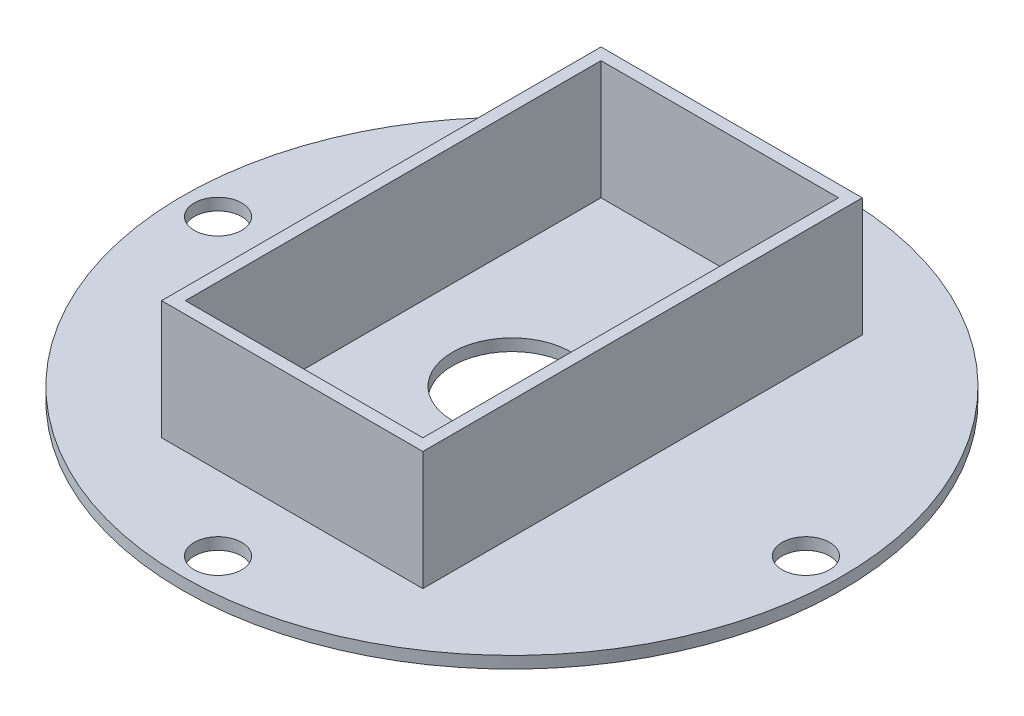
ISO-10303-21;
HEADER;
FILE_DESCRIPTION(('STEP AP214'),'2;1');
FILE_NAME('part.step','',(''),(''),'','','');
FILE_SCHEMA(('AUTOMOTIVE_DESIGN { 1 0 10303 214 1 1 1 1 }'));
ENDSEC;
DATA;
#1=APPLICATION_CONTEXT('core data for automotive mechanical design processes');
#2=APPLICATION_PROTOCOL_DEFINITION('international standard','automotive_design',2000,#1);
#3=PRODUCT_CONTEXT('',#1,'mechanical');
#4=PRODUCT('Part','Part','',(#3));
#5=PRODUCT_RELATED_PRODUCT_CATEGORY('part','',(#4));
#6=PRODUCT_DEFINITION_FORMATION('','',#4);
#7=PRODUCT_DEFINITION_CONTEXT('part definition',#1,'design');
#8=PRODUCT_DEFINITION('design','',#6,#7);
#9=PRODUCT_DEFINITION_SHAPE('','',#8);
#10=(LENGTH_UNIT() NAMED_UNIT(*) SI_UNIT(.MILLI.,.METRE.));
#11=(NAMED_UNIT(*) PLANE_ANGLE_UNIT() SI_UNIT($,.RADIAN.));
#12=(NAMED_UNIT(*) SI_UNIT($,.STERADIAN.) SOLID_ANGLE_UNIT());
#13=UNCERTAINTY_MEASURE_WITH_UNIT(LENGTH_MEASURE(1.E-05),#10,'distance_accuracy_value','');
#14=(GEOMETRIC_REPRESENTATION_CONTEXT(3) GLOBAL_UNCERTAINTY_ASSIGNED_CONTEXT((#13)) GLOBAL_UNIT_ASSIGNED_CONTEXT((#10,
#11,#12)) REPRESENTATION_CONTEXT('',''));
#15=CARTESIAN_POINT('',(0.,0.,0.));
#16=DIRECTION('',(0.,0.,1.));
#17=DIRECTION('',(1.,0.,0.));
#18=AXIS2_PLACEMENT_3D('',#15,#16,#17);
#19=CARTESIAN_POINT('',(0.,2.,0.));
#20=DIRECTION('',(0.,1.,0.));
#21=DIRECTION('',(0.,0.,1.));
#22=AXIS2_PLACEMENT_3D('',#19,#20,#21);
#23=PLANE('',#22);
#24=CARTESIAN_POINT('',(0.,2.,49.5));
#25=DIRECTION('',(0.,1.,0.));
#26=DIRECTION('',(0.,0.,1.));
#27=AXIS2_PLACEMENT_3D('',#24,#25,#26);
#28=CIRCLE('',#27,4.);
#29=CARTESIAN_POINT('',(0.,2.,53.5));
#30=VERTEX_POINT('',#29);
#31=EDGE_CURVE('E206',#30,#30,#28,.T.);
#32=ORIENTED_EDGE('',*,*,#31,.F.);
#33=EDGE_LOOP('',(#32));
#34=FACE_BOUND('',#33,.T.);
#35=CARTESIAN_POINT('',(49.5,2.,0.));
#36=DIRECTION('',(0.,1.,0.));
#37=DIRECTION('',(0.,0.,1.));
#38=AXIS2_PLACEMENT_3D('',#35,#36,#37);
#39=CIRCLE('',#38,4.);
#40=CARTESIAN_POINT('',(49.5,2.,4.));
#41=VERTEX_POINT('',#40);
#42=EDGE_CURVE('E222',#41,#41,#39,.T.);
#43=ORIENTED_EDGE('',*,*,#42,.F.);
#44=EDGE_LOOP('',(#43));
#45=FACE_BOUND('',#44,.T.);
#46=CARTESIAN_POINT('',(0.,2.,0.));
#47=DIRECTION('',(0.,1.,0.));
#48=DIRECTION('',(0.,0.,1.));
#49=AXIS2_PLACEMENT_3D('',#46,#47,#48);
#50=CIRCLE('',#49,55.5);
#51=CARTESIAN_POINT('',(0.,2.,55.5));
#52=VERTEX_POINT('',#51);
#53=EDGE_CURVE('E11',#52,#52,#50,.T.);
#54=ORIENTED_EDGE('',*,*,#53,.T.);
#55=EDGE_LOOP('',(#54));
#56=FACE_BOUND('',#55,.T.);
#57=CARTESIAN_POINT('',(0.,2.,-49.5));
#58=DIRECTION('',(0.,1.,0.));
#59=DIRECTION('',(0.,0.,1.));
#60=AXIS2_PLACEMENT_3D('',#57,#58,#59);
#61=CIRCLE('',#60,4.);
#62=CARTESIAN_POINT('',(0.,2.,-45.5));
#63=VERTEX_POINT('',#62);
#64=EDGE_CURVE('E230',#63,#63,#61,.T.);
#65=ORIENTED_EDGE('',*,*,#64,.F.);
#66=EDGE_LOOP('',(#65));
#67=FACE_BOUND('',#66,.T.);
#68=CARTESIAN_POINT('',(-49.5,2.,0.));
#69=DIRECTION('',(0.,1.,0.));
#70=DIRECTION('',(0.,0.,1.));
#71=AXIS2_PLACEMENT_3D('',#68,#69,#70);
#72=CIRCLE('',#71,4.);
#73=CARTESIAN_POINT('',(-49.5,2.,4.));
#74=VERTEX_POINT('',#73);
#75=EDGE_CURVE('E214',#74,#74,#72,.T.);
#76=ORIENTED_EDGE('',*,*,#75,.F.);
#77=EDGE_LOOP('',(#76));
#78=FACE_BOUND('',#77,.T.);
#79=DIRECTION('',(-1.,0.,0.));
#80=VECTOR('',#79,1.);
#81=CARTESIAN_POINT('',(-22.,2.,-37.));
#82=LINE('',#81,#80);
#83=CARTESIAN_POINT('',(22.,2.,-37.));
#84=VERTEX_POINT('',#83);
#85=CARTESIAN_POINT('',(-22.,2.,-37.));
#86=VERTEX_POINT('',#85);
#87=EDGE_CURVE('E185',#84,#86,#82,.T.);
#88=ORIENTED_EDGE('',*,*,#87,.F.);
#89=DIRECTION('',(0.,0.,-1.));
#90=VECTOR('',#89,1.);
#91=CARTESIAN_POINT('',(22.,2.,-37.));
#92=LINE('',#91,#90);
#93=CARTESIAN_POINT('',(22.,2.,37.));
#94=VERTEX_POINT('',#93);
#95=EDGE_CURVE('E134',#94,#84,#92,.T.);
#96=ORIENTED_EDGE('',*,*,#95,.F.);
#97=DIRECTION('',(1.,0.,0.));
#98=VECTOR('',#97,1.);
#99=CARTESIAN_POINT('',(-22.,2.,37.));
#100=LINE('',#99,#98);
#101=CARTESIAN_POINT('',(-22.,2.,37.));
#102=VERTEX_POINT('',#101);
#103=EDGE_CURVE('E172',#102,#94,#100,.T.);
#104=ORIENTED_EDGE('',*,*,#103,.F.);
#105=DIRECTION('',(0.,0.,1.));
#106=VECTOR('',#105,1.);
#107=CARTESIAN_POINT('',(-22.,2.,-37.));
#108=LINE('',#107,#106);
#109=EDGE_CURVE('E188',#86,#102,#108,.T.);
#110=ORIENTED_EDGE('',*,*,#109,.F.);
#111=EDGE_LOOP('',(#88,#96,#104,#110));
#112=FACE_BOUND('',#111,.T.);
#113=ADVANCED_FACE('F45',(#34,#45,#56,#67,#78,#112),#23,.T.);
#114=CARTESIAN_POINT('',(0.,0.,0.));
#115=DIRECTION('',(0.,1.,0.));
#116=DIRECTION('',(0.,0.,1.));
#117=AXIS2_PLACEMENT_3D('',#114,#115,#116);
#118=PLANE('',#117);
#119=CARTESIAN_POINT('',(0.,0.,0.));
#120=DIRECTION('',(0.,1.,0.));
#121=DIRECTION('',(0.,0.,1.));
#122=AXIS2_PLACEMENT_3D('',#119,#120,#121);
#123=CIRCLE('',#122,10.);
#124=CARTESIAN_POINT('',(0.,0.,10.));
#125=VERTEX_POINT('',#124);
#126=EDGE_CURVE('E49',#125,#125,#123,.T.);
#127=ORIENTED_EDGE('',*,*,#126,.T.);
#128=EDGE_LOOP('',(#127));
#129=FACE_BOUND('',#128,.T.);
#130=CARTESIAN_POINT('',(0.,0.,0.));
#131=DIRECTION('',(0.,1.,0.));
#132=DIRECTION('',(0.,0.,1.));
#133=AXIS2_PLACEMENT_3D('',#130,#131,#132);
#134=CIRCLE('',#133,55.5);
#135=CARTESIAN_POINT('',(0.,0.,55.5));
#136=VERTEX_POINT('',#135);
#137=EDGE_CURVE('E55',#136,#136,#134,.T.);
#138=ORIENTED_EDGE('',*,*,#137,.F.);
#139=EDGE_LOOP('',(#138));
#140=FACE_BOUND('',#139,.T.);
#141=CARTESIAN_POINT('',(0.,0.,-49.5));
#142=DIRECTION('',(0.,1.,0.));
#143=DIRECTION('',(0.,0.,1.));
#144=AXIS2_PLACEMENT_3D('',#141,#142,#143);
#145=CIRCLE('',#144,4.);
#146=CARTESIAN_POINT('',(0.,0.,-45.5));
#147=VERTEX_POINT('',#146);
#148=EDGE_CURVE('E226',#147,#147,#145,.T.);
#149=ORIENTED_EDGE('',*,*,#148,.T.);
#150=EDGE_LOOP('',(#149));
#151=FACE_BOUND('',#150,.T.);
#152=CARTESIAN_POINT('',(49.5,0.,0.));
#153=DIRECTION('',(0.,1.,0.));
#154=DIRECTION('',(0.,0.,1.));
#155=AXIS2_PLACEMENT_3D('',#152,#153,#154);
#156=CIRCLE('',#155,4.);
#157=CARTESIAN_POINT('',(49.5,0.,4.));
#158=VERTEX_POINT('',#157);
#159=EDGE_CURVE('E218',#158,#158,#156,.T.);
#160=ORIENTED_EDGE('',*,*,#159,.T.);
#161=EDGE_LOOP('',(#160));
#162=FACE_BOUND('',#161,.T.);
#163=CARTESIAN_POINT('',(-49.5,0.,0.));
#164=DIRECTION('',(0.,1.,0.));
#165=DIRECTION('',(0.,0.,1.));
#166=AXIS2_PLACEMENT_3D('',#163,#164,#165);
#167=CIRCLE('',#166,4.);
#168=CARTESIAN_POINT('',(-49.5,0.,4.));
#169=VERTEX_POINT('',#168);
#170=EDGE_CURVE('E210',#169,#169,#167,.T.);
#171=ORIENTED_EDGE('',*,*,#170,.T.);
#172=EDGE_LOOP('',(#171));
#173=FACE_BOUND('',#172,.T.);
#174=CARTESIAN_POINT('',(0.,0.,49.5));
#175=DIRECTION('',(0.,1.,0.));
#176=DIRECTION('',(0.,0.,1.));
#177=AXIS2_PLACEMENT_3D('',#174,#175,#176);
#178=CIRCLE('',#177,4.);
#179=CARTESIAN_POINT('',(0.,0.,53.5));
#180=VERTEX_POINT('',#179);
#181=EDGE_CURVE('E205',#180,#180,#178,.T.);
#182=ORIENTED_EDGE('',*,*,#181,.T.);
#183=EDGE_LOOP('',(#182));
#184=FACE_BOUND('',#183,.T.);
#185=ADVANCED_FACE('F241',(#129,#140,#151,#162,#173,#184),#118,.F.);
#186=CARTESIAN_POINT('',(0.,2.,0.));
#187=DIRECTION('',(0.,-1.,0.));
#188=DIRECTION('',(0.,0.,-1.));
#189=AXIS2_PLACEMENT_3D('',#186,#187,#188);
#190=CYLINDRICAL_SURFACE('',#189,55.5);
#191=ORIENTED_EDGE('',*,*,#53,.F.);
#192=EDGE_LOOP('',(#191));
#193=FACE_BOUND('',#192,.T.);
#194=ORIENTED_EDGE('',*,*,#137,.T.);
#195=EDGE_LOOP('',(#194));
#196=FACE_BOUND('',#195,.T.);
#197=ADVANCED_FACE('F47',(#193,#196),#190,.T.);
#198=CARTESIAN_POINT('',(0.,2.,-49.5));
#199=DIRECTION('',(0.,-1.,0.));
#200=DIRECTION('',(0.,0.,-1.));
#201=AXIS2_PLACEMENT_3D('',#198,#199,#200);
#202=CYLINDRICAL_SURFACE('',#201,4.);
#203=ORIENTED_EDGE('',*,*,#64,.T.);
#204=EDGE_LOOP('',(#203));
#205=FACE_BOUND('',#204,.T.);
#206=ORIENTED_EDGE('',*,*,#148,.F.);
#207=EDGE_LOOP('',(#206));
#208=FACE_BOUND('',#207,.T.);
#209=ADVANCED_FACE('F408',(#205,#208),#202,.F.);
#210=CARTESIAN_POINT('',(49.5,2.,0.));
#211=DIRECTION('',(0.,-1.,0.));
#212=DIRECTION('',(0.,0.,-1.));
#213=AXIS2_PLACEMENT_3D('',#210,#211,#212);
#214=CYLINDRICAL_SURFACE('',#213,4.);
#215=ORIENTED_EDGE('',*,*,#42,.T.);
#216=EDGE_LOOP('',(#215));
#217=FACE_BOUND('',#216,.T.);
#218=ORIENTED_EDGE('',*,*,#159,.F.);
#219=EDGE_LOOP('',(#218));
#220=FACE_BOUND('',#219,.T.);
#221=ADVANCED_FACE('F266',(#217,#220),#214,.F.);
#222=CARTESIAN_POINT('',(-49.5,2.,0.));
#223=DIRECTION('',(0.,-1.,0.));
#224=DIRECTION('',(0.,0.,-1.));
#225=AXIS2_PLACEMENT_3D('',#222,#223,#224);
#226=CYLINDRICAL_SURFACE('',#225,4.);
#227=ORIENTED_EDGE('',*,*,#75,.T.);
#228=EDGE_LOOP('',(#227));
#229=FACE_BOUND('',#228,.T.);
#230=ORIENTED_EDGE('',*,*,#170,.F.);
#231=EDGE_LOOP('',(#230));
#232=FACE_BOUND('',#231,.T.);
#233=ADVANCED_FACE('F255',(#229,#232),#226,.F.);
#234=CARTESIAN_POINT('',(0.,2.,49.5));
#235=DIRECTION('',(0.,-1.,0.));
#236=DIRECTION('',(0.,0.,-1.));
#237=AXIS2_PLACEMENT_3D('',#234,#235,#236);
#238=CYLINDRICAL_SURFACE('',#237,4.);
#239=ORIENTED_EDGE('',*,*,#31,.T.);
#240=EDGE_LOOP('',(#239));
#241=FACE_BOUND('',#240,.T.);
#242=ORIENTED_EDGE('',*,*,#181,.F.);
#243=EDGE_LOOP('',(#242));
#244=FACE_BOUND('',#243,.T.);
#245=ADVANCED_FACE('F253',(#241,#244),#238,.F.);
#246=CARTESIAN_POINT('',(0.,22.,0.));
#247=DIRECTION('',(0.,1.,0.));
#248=DIRECTION('',(0.,0.,1.));
#249=AXIS2_PLACEMENT_3D('',#246,#247,#248);
#250=PLANE('',#249);
#251=DIRECTION('',(0.,0.,-1.));
#252=VECTOR('',#251,1.);
#253=CARTESIAN_POINT('',(22.,22.,-37.));
#254=LINE('',#253,#252);
#255=CARTESIAN_POINT('',(22.,22.,37.));
#256=VERTEX_POINT('',#255);
#257=CARTESIAN_POINT('',(22.,22.,-37.));
#258=VERTEX_POINT('',#257);
#259=EDGE_CURVE('E167',#256,#258,#254,.T.);
#260=ORIENTED_EDGE('',*,*,#259,.T.);
#261=DIRECTION('',(-1.,0.,0.));
#262=VECTOR('',#261,1.);
#263=CARTESIAN_POINT('',(-22.,22.,-37.));
#264=LINE('',#263,#262);
#265=CARTESIAN_POINT('',(-22.,22.,-37.));
#266=VERTEX_POINT('',#265);
#267=EDGE_CURVE('E171',#258,#266,#264,.T.);
#268=ORIENTED_EDGE('',*,*,#267,.T.);
#269=DIRECTION('',(0.,0.,1.));
#270=VECTOR('',#269,1.);
#271=CARTESIAN_POINT('',(-22.,22.,-37.));
#272=LINE('',#271,#270);
#273=CARTESIAN_POINT('',(-22.,22.,37.));
#274=VERTEX_POINT('',#273);
#275=EDGE_CURVE('E175',#266,#274,#272,.T.);
#276=ORIENTED_EDGE('',*,*,#275,.T.);
#277=DIRECTION('',(1.,0.,0.));
#278=VECTOR('',#277,1.);
#279=CARTESIAN_POINT('',(-22.,22.,37.));
#280=LINE('',#279,#278);
#281=EDGE_CURVE('E178',#274,#256,#280,.T.);
#282=ORIENTED_EDGE('',*,*,#281,.T.);
#283=EDGE_LOOP('',(#260,#268,#276,#282));
#284=FACE_BOUND('',#283,.T.);
#285=DIRECTION('',(-1.,0.,0.));
#286=VECTOR('',#285,1.);
#287=CARTESIAN_POINT('',(-20.,22.,-35.));
#288=LINE('',#287,#286);
#289=CARTESIAN_POINT('',(20.,22.,-35.));
#290=VERTEX_POINT('',#289);
#291=CARTESIAN_POINT('',(-20.,22.,-35.));
#292=VERTEX_POINT('',#291);
#293=EDGE_CURVE('E125',#290,#292,#288,.T.);
#294=ORIENTED_EDGE('',*,*,#293,.F.);
#295=DIRECTION('',(0.,0.,-1.));
#296=VECTOR('',#295,1.);
#297=CARTESIAN_POINT('',(20.,22.,-35.));
#298=LINE('',#297,#296);
#299=CARTESIAN_POINT('',(20.,22.,35.));
#300=VERTEX_POINT('',#299);
#301=EDGE_CURVE('E115',#300,#290,#298,.T.);
#302=ORIENTED_EDGE('',*,*,#301,.F.);
#303=DIRECTION('',(1.,0.,0.));
#304=VECTOR('',#303,1.);
#305=CARTESIAN_POINT('',(-20.,22.,35.));
#306=LINE('',#305,#304);
#307=CARTESIAN_POINT('',(-20.,22.,35.));
#308=VERTEX_POINT('',#307);
#309=EDGE_CURVE('E144',#308,#300,#306,.T.);
#310=ORIENTED_EDGE('',*,*,#309,.F.);
#311=DIRECTION('',(0.,0.,1.));
#312=VECTOR('',#311,1.);
#313=CARTESIAN_POINT('',(-20.,22.,-35.));
#314=LINE('',#313,#312);
#315=EDGE_CURVE('E140',#292,#308,#314,.T.);
#316=ORIENTED_EDGE('',*,*,#315,.F.);
#317=EDGE_LOOP('',(#294,#302,#310,#316));
#318=FACE_BOUND('',#317,.T.);
#319=ADVANCED_FACE('F138',(#284,#318),#250,.T.);
#320=CARTESIAN_POINT('',(22.,22.,-37.));
#321=DIRECTION('',(-1.,0.,0.));
#322=DIRECTION('',(0.,0.,1.));
#323=AXIS2_PLACEMENT_3D('',#320,#321,#322);
#324=PLANE('',#323);
#325=ORIENTED_EDGE('',*,*,#95,.T.);
#326=DIRECTION('',(0.,-1.,0.));
#327=VECTOR('',#326,1.);
#328=CARTESIAN_POINT('',(22.,22.,-37.));
#329=LINE('',#328,#327);
#330=EDGE_CURVE('E202',#258,#84,#329,.T.);
#331=ORIENTED_EDGE('',*,*,#330,.F.);
#332=ORIENTED_EDGE('',*,*,#259,.F.);
#333=DIRECTION('',(0.,-1.,0.));
#334=VECTOR('',#333,1.);
#335=CARTESIAN_POINT('',(22.,22.,37.));
#336=LINE('',#335,#334);
#337=EDGE_CURVE('E181',#256,#94,#336,.T.);
#338=ORIENTED_EDGE('',*,*,#337,.T.);
#339=EDGE_LOOP('',(#325,#331,#332,#338));
#340=FACE_BOUND('',#339,.T.);
#341=ADVANCED_FACE('F263',(#340),#324,.F.);
#342=CARTESIAN_POINT('',(-22.,22.,-37.));
#343=DIRECTION('',(0.,0.,1.));
#344=DIRECTION('',(1.,0.,0.));
#345=AXIS2_PLACEMENT_3D('',#342,#343,#344);
#346=PLANE('',#345);
#347=ORIENTED_EDGE('',*,*,#87,.T.);
#348=DIRECTION('',(0.,-1.,0.));
#349=VECTOR('',#348,1.);
#350=CARTESIAN_POINT('',(-22.,22.,-37.));
#351=LINE('',#350,#349);
#352=EDGE_CURVE('E198',#266,#86,#351,.T.);
#353=ORIENTED_EDGE('',*,*,#352,.F.);
#354=ORIENTED_EDGE('',*,*,#267,.F.);
#355=ORIENTED_EDGE('',*,*,#330,.T.);
#356=EDGE_LOOP('',(#347,#353,#354,#355));
#357=FACE_BOUND('',#356,.T.);
#358=ADVANCED_FACE('F316',(#357),#346,.F.);
#359=CARTESIAN_POINT('',(-22.,22.,-37.));
#360=DIRECTION('',(1.,0.,0.));
#361=DIRECTION('',(0.,0.,-1.));
#362=AXIS2_PLACEMENT_3D('',#359,#360,#361);
#363=PLANE('',#362);
#364=ORIENTED_EDGE('',*,*,#109,.T.);
#365=DIRECTION('',(0.,-1.,0.));
#366=VECTOR('',#365,1.);
#367=CARTESIAN_POINT('',(-22.,22.,37.));
#368=LINE('',#367,#366);
#369=EDGE_CURVE('E63',#274,#102,#368,.T.);
#370=ORIENTED_EDGE('',*,*,#369,.F.);
#371=ORIENTED_EDGE('',*,*,#275,.F.);
#372=ORIENTED_EDGE('',*,*,#352,.T.);
#373=EDGE_LOOP('',(#364,#370,#371,#372));
#374=FACE_BOUND('',#373,.T.);
#375=ADVANCED_FACE('F313',(#374),#363,.F.);
#376=CARTESIAN_POINT('',(-22.,22.,37.));
#377=DIRECTION('',(0.,0.,-1.));
#378=DIRECTION('',(-1.,0.,0.));
#379=AXIS2_PLACEMENT_3D('',#376,#377,#378);
#380=PLANE('',#379);
#381=ORIENTED_EDGE('',*,*,#103,.T.);
#382=ORIENTED_EDGE('',*,*,#337,.F.);
#383=ORIENTED_EDGE('',*,*,#281,.F.);
#384=ORIENTED_EDGE('',*,*,#369,.T.);
#385=EDGE_LOOP('',(#381,#382,#383,#384));
#386=FACE_BOUND('',#385,.T.);
#387=ADVANCED_FACE('F309',(#386),#380,.F.);
#388=CARTESIAN_POINT('',(20.,22.,-35.));
#389=DIRECTION('',(-1.,0.,0.));
#390=DIRECTION('',(0.,0.,1.));
#391=AXIS2_PLACEMENT_3D('',#388,#389,#390);
#392=PLANE('',#391);
#393=DIRECTION('',(0.,0.,-1.));
#394=VECTOR('',#393,1.);
#395=CARTESIAN_POINT('',(20.,2.,-35.));
#396=LINE('',#395,#394);
#397=CARTESIAN_POINT('',(20.,2.,35.));
#398=VERTEX_POINT('',#397);
#399=CARTESIAN_POINT('',(20.,2.,-35.));
#400=VERTEX_POINT('',#399);
#401=EDGE_CURVE('E71',#398,#400,#396,.T.);
#402=ORIENTED_EDGE('',*,*,#401,.F.);
#403=DIRECTION('',(0.,-1.,0.));
#404=VECTOR('',#403,1.);
#405=CARTESIAN_POINT('',(20.,22.,35.));
#406=LINE('',#405,#404);
#407=EDGE_CURVE('E120',#300,#398,#406,.T.);
#408=ORIENTED_EDGE('',*,*,#407,.F.);
#409=ORIENTED_EDGE('',*,*,#301,.T.);
#410=DIRECTION('',(0.,-1.,0.));
#411=VECTOR('',#410,1.);
#412=CARTESIAN_POINT('',(20.,22.,-35.));
#413=LINE('',#412,#411);
#414=EDGE_CURVE('E118',#290,#400,#413,.T.);
#415=ORIENTED_EDGE('',*,*,#414,.T.);
#416=EDGE_LOOP('',(#402,#408,#409,#415));
#417=FACE_BOUND('',#416,.T.);
#418=ADVANCED_FACE('F117',(#417),#392,.T.);
#419=CARTESIAN_POINT('',(-20.,22.,-35.));
#420=DIRECTION('',(0.,0.,1.));
#421=DIRECTION('',(1.,0.,0.));
#422=AXIS2_PLACEMENT_3D('',#419,#420,#421);
#423=PLANE('',#422);
#424=DIRECTION('',(-1.,0.,0.));
#425=VECTOR('',#424,1.);
#426=CARTESIAN_POINT('',(-20.,2.,-35.));
#427=LINE('',#426,#425);
#428=CARTESIAN_POINT('',(-20.,2.,-35.));
#429=VERTEX_POINT('',#428);
#430=EDGE_CURVE('E132',#400,#429,#427,.T.);
#431=ORIENTED_EDGE('',*,*,#430,.F.);
#432=ORIENTED_EDGE('',*,*,#414,.F.);
#433=ORIENTED_EDGE('',*,*,#293,.T.);
#434=DIRECTION('',(0.,-1.,0.));
#435=VECTOR('',#434,1.);
#436=CARTESIAN_POINT('',(-20.,22.,-35.));
#437=LINE('',#436,#435);
#438=EDGE_CURVE('E135',#292,#429,#437,.T.);
#439=ORIENTED_EDGE('',*,*,#438,.T.);
#440=EDGE_LOOP('',(#431,#432,#433,#439));
#441=FACE_BOUND('',#440,.T.);
#442=ADVANCED_FACE('F129',(#441),#423,.T.);
#443=CARTESIAN_POINT('',(-20.,22.,-35.));
#444=DIRECTION('',(1.,0.,0.));
#445=DIRECTION('',(0.,0.,-1.));
#446=AXIS2_PLACEMENT_3D('',#443,#444,#445);
#447=PLANE('',#446);
#448=DIRECTION('',(0.,0.,1.));
#449=VECTOR('',#448,1.);
#450=CARTESIAN_POINT('',(-20.,2.,-35.));
#451=LINE('',#450,#449);
#452=CARTESIAN_POINT('',(-20.,2.,35.));
#453=VERTEX_POINT('',#452);
#454=EDGE_CURVE('E154',#429,#453,#451,.T.);
#455=ORIENTED_EDGE('',*,*,#454,.F.);
#456=ORIENTED_EDGE('',*,*,#438,.F.);
#457=ORIENTED_EDGE('',*,*,#315,.T.);
#458=DIRECTION('',(0.,-1.,0.));
#459=VECTOR('',#458,1.);
#460=CARTESIAN_POINT('',(-20.,22.,35.));
#461=LINE('',#460,#459);
#462=EDGE_CURVE('E161',#308,#453,#461,.T.);
#463=ORIENTED_EDGE('',*,*,#462,.T.);
#464=EDGE_LOOP('',(#455,#456,#457,#463));
#465=FACE_BOUND('',#464,.T.);
#466=ADVANCED_FACE('F288',(#465),#447,.T.);
#467=CARTESIAN_POINT('',(-20.,22.,35.));
#468=DIRECTION('',(0.,0.,-1.));
#469=DIRECTION('',(-1.,0.,0.));
#470=AXIS2_PLACEMENT_3D('',#467,#468,#469);
#471=PLANE('',#470);
#472=DIRECTION('',(1.,0.,0.));
#473=VECTOR('',#472,1.);
#474=CARTESIAN_POINT('',(-20.,2.,35.));
#475=LINE('',#474,#473);
#476=EDGE_CURVE('E126',#453,#398,#475,.T.);
#477=ORIENTED_EDGE('',*,*,#476,.F.);
#478=ORIENTED_EDGE('',*,*,#462,.F.);
#479=ORIENTED_EDGE('',*,*,#309,.T.);
#480=ORIENTED_EDGE('',*,*,#407,.T.);
#481=EDGE_LOOP('',(#477,#478,#479,#480));
#482=FACE_BOUND('',#481,.T.);
#483=ADVANCED_FACE('F280',(#482),#471,.T.);
#484=CARTESIAN_POINT('',(0.,2.,0.));
#485=DIRECTION('',(0.,1.,0.));
#486=DIRECTION('',(0.,0.,1.));
#487=AXIS2_PLACEMENT_3D('',#484,#485,#486);
#488=CIRCLE('',#487,10.);
#489=CARTESIAN_POINT('',(0.,2.,10.));
#490=VERTEX_POINT('',#489);
#491=EDGE_CURVE('E293',#490,#490,#488,.T.);
#492=ORIENTED_EDGE('',*,*,#491,.F.);
#493=EDGE_LOOP('',(#492));
#494=FACE_BOUND('',#493,.T.);
#495=ORIENTED_EDGE('',*,*,#401,.T.);
#496=ORIENTED_EDGE('',*,*,#430,.T.);
#497=ORIENTED_EDGE('',*,*,#454,.T.);
#498=ORIENTED_EDGE('',*,*,#476,.T.);
#499=EDGE_LOOP('',(#495,#496,#497,#498));
#500=FACE_BOUND('',#499,.T.);
#501=ADVANCED_FACE('F272',(#494,#500),#23,.T.);
#502=CARTESIAN_POINT('',(0.,-28.,0.));
#503=DIRECTION('',(0.,1.,0.));
#504=DIRECTION('',(0.,0.,1.));
#505=AXIS2_PLACEMENT_3D('',#502,#503,#504);
#506=CYLINDRICAL_SURFACE('',#505,10.);
#507=ORIENTED_EDGE('',*,*,#491,.T.);
#508=EDGE_LOOP('',(#507));
#509=FACE_BOUND('',#508,.T.);
#510=ORIENTED_EDGE('',*,*,#126,.F.);
#511=EDGE_LOOP('',(#510));
#512=FACE_BOUND('',#511,.T.);
#513=ADVANCED_FACE('F279',(#509,#512),#506,.F.);
#514=CLOSED_SHELL('',(#113,#185,#197,#209,#221,#233,#245,#319,#341,#358,#375,#387,#418,#442,
#466,#483,#501,#513));
#515=MANIFOLD_SOLID_BREP('B2',#514);
#516=ADVANCED_BREP_SHAPE_REPRESENTATION('',(#18,#515),#14);
#517=SHAPE_DEFINITION_REPRESENTATION(#9,#516);
ENDSEC;
END-ISO-10303-21;
